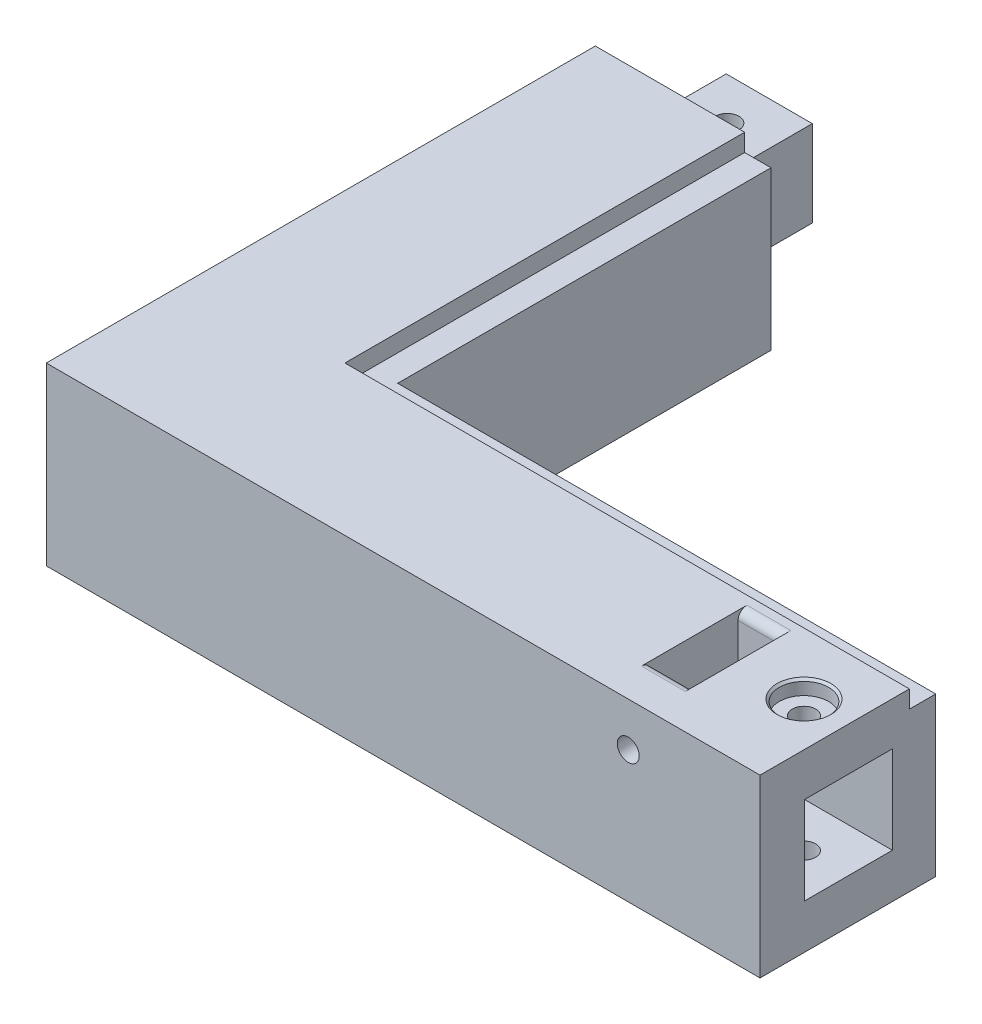
ISO-10303-21;
HEADER;
FILE_DESCRIPTION(('STEP AP214'),'2;1');
FILE_NAME('part.step','',(''),(''),'','','');
FILE_SCHEMA(('AUTOMOTIVE_DESIGN { 1 0 10303 214 1 1 1 1 }'));
ENDSEC;
DATA;
#1=APPLICATION_CONTEXT('core data for automotive mechanical design processes');
#2=APPLICATION_PROTOCOL_DEFINITION('international standard','automotive_design',2000,#1);
#3=PRODUCT_CONTEXT('',#1,'mechanical');
#4=PRODUCT('Part','Part','',(#3));
#5=PRODUCT_RELATED_PRODUCT_CATEGORY('part','',(#4));
#6=PRODUCT_DEFINITION_FORMATION('','',#4);
#7=PRODUCT_DEFINITION_CONTEXT('part definition',#1,'design');
#8=PRODUCT_DEFINITION('design','',#6,#7);
#9=PRODUCT_DEFINITION_SHAPE('','',#8);
#10=(LENGTH_UNIT() NAMED_UNIT(*) SI_UNIT(.MILLI.,.METRE.));
#11=(NAMED_UNIT(*) PLANE_ANGLE_UNIT() SI_UNIT($,.RADIAN.));
#12=(NAMED_UNIT(*) SI_UNIT($,.STERADIAN.) SOLID_ANGLE_UNIT());
#13=UNCERTAINTY_MEASURE_WITH_UNIT(LENGTH_MEASURE(1.E-05),#10,'distance_accuracy_value','');
#14=(GEOMETRIC_REPRESENTATION_CONTEXT(3) GLOBAL_UNCERTAINTY_ASSIGNED_CONTEXT((#13)) GLOBAL_UNIT_ASSIGNED_CONTEXT((#10,
#11,#12)) REPRESENTATION_CONTEXT('',''));
#15=CARTESIAN_POINT('',(0.,0.,0.));
#16=DIRECTION('',(0.,0.,1.));
#17=DIRECTION('',(1.,0.,0.));
#18=AXIS2_PLACEMENT_3D('',#15,#16,#17);
#19=CARTESIAN_POINT('',(-50.8,50.8,-107.95));
#20=DIRECTION('',(0.,0.,1.));
#21=DIRECTION('',(1.,0.,0.));
#22=AXIS2_PLACEMENT_3D('',#19,#20,#21);
#23=PLANE('',#22);
#24=DIRECTION('',(-1.,0.,0.));
#25=VECTOR('',#24,1.);
#26=CARTESIAN_POINT('',(-50.8,50.8,-107.95));
#27=LINE('',#26,#25);
#28=CARTESIAN_POINT('',(-7.61999999999999,50.8,-107.95));
#29=VERTEX_POINT('',#28);
#30=CARTESIAN_POINT('',(-50.8,50.8,-107.95));
#31=VERTEX_POINT('',#30);
#32=EDGE_CURVE('E224',#29,#31,#27,.T.);
#33=ORIENTED_EDGE('',*,*,#32,.F.);
#34=DIRECTION('',(0.,1.,0.));
#35=VECTOR('',#34,1.);
#36=CARTESIAN_POINT('',(-7.61999999999999,45.72,-107.95));
#37=LINE('',#36,#35);
#38=CARTESIAN_POINT('',(-7.61999999999999,45.72,-107.95));
#39=VERTEX_POINT('',#38);
#40=EDGE_CURVE('E62',#39,#29,#37,.T.);
#41=ORIENTED_EDGE('',*,*,#40,.F.);
#42=DIRECTION('',(-1.,0.,0.));
#43=VECTOR('',#42,1.);
#44=CARTESIAN_POINT('',(-7.61999999999999,45.72,-107.95));
#45=LINE('',#44,#43);
#46=CARTESIAN_POINT('',(0.,45.72,-107.95));
#47=VERTEX_POINT('',#46);
#48=EDGE_CURVE('E210',#47,#39,#45,.T.);
#49=ORIENTED_EDGE('',*,*,#48,.F.);
#50=DIRECTION('',(0.,-1.,0.));
#51=VECTOR('',#50,1.);
#52=CARTESIAN_POINT('',(0.,50.8,-107.95));
#53=LINE('',#52,#51);
#54=CARTESIAN_POINT('',(0.,0.,-107.95));
#55=VERTEX_POINT('',#54);
#56=EDGE_CURVE('E440',#47,#55,#53,.T.);
#57=ORIENTED_EDGE('',*,*,#56,.T.);
#58=DIRECTION('',(-1.,0.,0.));
#59=VECTOR('',#58,1.);
#60=CARTESIAN_POINT('',(-50.8,0.,-107.95));
#61=LINE('',#60,#59);
#62=CARTESIAN_POINT('',(-50.8,0.,-107.95));
#63=VERTEX_POINT('',#62);
#64=EDGE_CURVE('E407',#55,#63,#61,.T.);
#65=ORIENTED_EDGE('',*,*,#64,.T.);
#66=DIRECTION('',(0.,-1.,0.));
#67=VECTOR('',#66,1.);
#68=CARTESIAN_POINT('',(-50.8,50.8,-107.95));
#69=LINE('',#68,#67);
#70=EDGE_CURVE('E436',#31,#63,#69,.T.);
#71=ORIENTED_EDGE('',*,*,#70,.F.);
#72=EDGE_LOOP('',(#33,#41,#49,#57,#65,#71));
#73=FACE_BOUND('',#72,.T.);
#74=DIRECTION('',(0.,1.,0.));
#75=VECTOR('',#74,1.);
#76=CARTESIAN_POINT('',(-37.846,12.954,-107.95));
#77=LINE('',#76,#75);
#78=CARTESIAN_POINT('',(-37.846,12.954,-107.95));
#79=VERTEX_POINT('',#78);
#80=CARTESIAN_POINT('',(-37.846,37.846,-107.95));
#81=VERTEX_POINT('',#80);
#82=EDGE_CURVE('E290',#79,#81,#77,.T.);
#83=ORIENTED_EDGE('',*,*,#82,.F.);
#84=DIRECTION('',(-1.,0.,0.));
#85=VECTOR('',#84,1.);
#86=CARTESIAN_POINT('',(-12.954,12.954,-107.95));
#87=LINE('',#86,#85);
#88=CARTESIAN_POINT('',(-12.954,12.954,-107.95));
#89=VERTEX_POINT('',#88);
#90=EDGE_CURVE('E280',#89,#79,#87,.T.);
#91=ORIENTED_EDGE('',*,*,#90,.F.);
#92=DIRECTION('',(0.,-1.,0.));
#93=VECTOR('',#92,1.);
#94=CARTESIAN_POINT('',(-12.954,12.954,-107.95));
#95=LINE('',#94,#93);
#96=CARTESIAN_POINT('',(-12.954,37.846,-107.95));
#97=VERTEX_POINT('',#96);
#98=EDGE_CURVE('E298',#97,#89,#95,.T.);
#99=ORIENTED_EDGE('',*,*,#98,.F.);
#100=DIRECTION('',(1.,0.,0.));
#101=VECTOR('',#100,1.);
#102=CARTESIAN_POINT('',(-12.954,37.846,-107.95));
#103=LINE('',#102,#101);
#104=EDGE_CURVE('E294',#81,#97,#103,.T.);
#105=ORIENTED_EDGE('',*,*,#104,.F.);
#106=EDGE_LOOP('',(#83,#91,#99,#105));
#107=FACE_BOUND('',#106,.T.);
#108=ADVANCED_FACE('F45',(#73,#107),#23,.F.);
#109=CARTESIAN_POINT('',(0.,50.8,0.));
#110=DIRECTION('',(-1.,0.,0.));
#111=DIRECTION('',(0.,0.,1.));
#112=AXIS2_PLACEMENT_3D('',#109,#110,#111);
#113=PLANE('',#112);
#114=ORIENTED_EDGE('',*,*,#56,.F.);
#115=DIRECTION('',(0.,0.,-1.));
#116=VECTOR('',#115,1.);
#117=CARTESIAN_POINT('',(0.,45.72,-107.95));
#118=LINE('',#117,#116);
#119=CARTESIAN_POINT('',(0.,45.72,0.));
#120=VERTEX_POINT('',#119);
#121=EDGE_CURVE('E215',#120,#47,#118,.T.);
#122=ORIENTED_EDGE('',*,*,#121,.F.);
#123=DIRECTION('',(0.,-1.,0.));
#124=VECTOR('',#123,1.);
#125=CARTESIAN_POINT('',(0.,50.8,0.));
#126=LINE('',#125,#124);
#127=CARTESIAN_POINT('',(0.,0.,0.));
#128=VERTEX_POINT('',#127);
#129=EDGE_CURVE('E403',#120,#128,#126,.T.);
#130=ORIENTED_EDGE('',*,*,#129,.T.);
#131=DIRECTION('',(0.,0.,-1.));
#132=VECTOR('',#131,1.);
#133=CARTESIAN_POINT('',(0.,0.,0.));
#134=LINE('',#133,#132);
#135=EDGE_CURVE('E380',#128,#55,#134,.T.);
#136=ORIENTED_EDGE('',*,*,#135,.T.);
#137=EDGE_LOOP('',(#114,#122,#130,#136));
#138=FACE_BOUND('',#137,.T.);
#139=ADVANCED_FACE('F522',(#138),#113,.F.);
#140=CARTESIAN_POINT('',(-50.8,50.8,50.8));
#141=DIRECTION('',(1.,0.,0.));
#142=DIRECTION('',(0.,0.,-1.));
#143=AXIS2_PLACEMENT_3D('',#140,#141,#142);
#144=PLANE('',#143);
#145=DIRECTION('',(0.,0.,1.));
#146=VECTOR('',#145,1.);
#147=CARTESIAN_POINT('',(-50.8,0.,50.8));
#148=LINE('',#147,#146);
#149=CARTESIAN_POINT('',(-50.8,0.,50.8));
#150=VERTEX_POINT('',#149);
#151=EDGE_CURVE('E410',#63,#150,#148,.T.);
#152=ORIENTED_EDGE('',*,*,#151,.T.);
#153=DIRECTION('',(0.,-1.,0.));
#154=VECTOR('',#153,1.);
#155=CARTESIAN_POINT('',(-50.8,50.8,50.8));
#156=LINE('',#155,#154);
#157=CARTESIAN_POINT('',(-50.8,50.8,50.8));
#158=VERTEX_POINT('',#157);
#159=EDGE_CURVE('E432',#158,#150,#156,.T.);
#160=ORIENTED_EDGE('',*,*,#159,.F.);
#161=DIRECTION('',(0.,0.,1.));
#162=VECTOR('',#161,1.);
#163=CARTESIAN_POINT('',(-50.8,50.8,50.8));
#164=LINE('',#163,#162);
#165=EDGE_CURVE('E392',#31,#158,#164,.T.);
#166=ORIENTED_EDGE('',*,*,#165,.F.);
#167=ORIENTED_EDGE('',*,*,#70,.T.);
#168=EDGE_LOOP('',(#152,#160,#166,#167));
#169=FACE_BOUND('',#168,.T.);
#170=ADVANCED_FACE('F528',(#169),#144,.F.);
#171=CARTESIAN_POINT('',(-50.8,50.8,50.8));
#172=DIRECTION('',(0.,0.,-1.));
#173=DIRECTION('',(-1.,0.,0.));
#174=AXIS2_PLACEMENT_3D('',#171,#172,#173);
#175=PLANE('',#174);
#176=CARTESIAN_POINT('',(117.475,38.1,50.8));
#177=DIRECTION('',(0.,0.,1.));
#178=DIRECTION('',(1.,0.,0.));
#179=AXIS2_PLACEMENT_3D('',#176,#177,#178);
#180=CIRCLE('',#179,3.175);
#181=CARTESIAN_POINT('',(120.65,38.1,50.8));
#182=VERTEX_POINT('',#181);
#183=EDGE_CURVE('E498',#182,#182,#180,.T.);
#184=ORIENTED_EDGE('',*,*,#183,.F.);
#185=EDGE_LOOP('',(#184));
#186=FACE_BOUND('',#185,.T.);
#187=DIRECTION('',(1.,0.,0.));
#188=VECTOR('',#187,1.);
#189=CARTESIAN_POINT('',(-50.8,0.,50.8));
#190=LINE('',#189,#188);
#191=CARTESIAN_POINT('',(155.575,0.,50.8));
#192=VERTEX_POINT('',#191);
#193=EDGE_CURVE('E413',#150,#192,#190,.T.);
#194=ORIENTED_EDGE('',*,*,#193,.T.);
#195=DIRECTION('',(0.,-1.,0.));
#196=VECTOR('',#195,1.);
#197=CARTESIAN_POINT('',(155.575,50.8,50.8));
#198=LINE('',#197,#196);
#199=CARTESIAN_POINT('',(155.575,50.8,50.8));
#200=VERTEX_POINT('',#199);
#201=EDGE_CURVE('E428',#200,#192,#198,.T.);
#202=ORIENTED_EDGE('',*,*,#201,.F.);
#203=DIRECTION('',(1.,0.,0.));
#204=VECTOR('',#203,1.);
#205=CARTESIAN_POINT('',(-50.8,50.8,50.8));
#206=LINE('',#205,#204);
#207=EDGE_CURVE('E396',#158,#200,#206,.T.);
#208=ORIENTED_EDGE('',*,*,#207,.F.);
#209=ORIENTED_EDGE('',*,*,#159,.T.);
#210=EDGE_LOOP('',(#194,#202,#208,#209));
#211=FACE_BOUND('',#210,.T.);
#212=ADVANCED_FACE('F649',(#186,#211),#175,.F.);
#213=CARTESIAN_POINT('',(155.575,50.8,0.));
#214=DIRECTION('',(-1.,0.,0.));
#215=DIRECTION('',(0.,0.,1.));
#216=AXIS2_PLACEMENT_3D('',#213,#214,#215);
#217=PLANE('',#216);
#218=DIRECTION('',(0.,0.,1.));
#219=VECTOR('',#218,1.);
#220=CARTESIAN_POINT('',(155.575,38.26008800011,37.9399119998899));
#221=LINE('',#220,#219);
#222=CARTESIAN_POINT('',(155.575,38.26008800011,12.5399119998898));
#223=VERTEX_POINT('',#222);
#224=CARTESIAN_POINT('',(155.575,38.26008800011,37.9399119998899));
#225=VERTEX_POINT('',#224);
#226=EDGE_CURVE('E366',#223,#225,#221,.T.);
#227=ORIENTED_EDGE('',*,*,#226,.F.);
#228=DIRECTION('',(0.,1.,0.));
#229=VECTOR('',#228,1.);
#230=CARTESIAN_POINT('',(155.575,12.86008800011,12.5399119998899));
#231=LINE('',#230,#229);
#232=CARTESIAN_POINT('',(155.575,12.86008800011,12.5399119998899));
#233=VERTEX_POINT('',#232);
#234=EDGE_CURVE('E345',#233,#223,#231,.T.);
#235=ORIENTED_EDGE('',*,*,#234,.F.);
#236=DIRECTION('',(0.,0.,-1.));
#237=VECTOR('',#236,1.);
#238=CARTESIAN_POINT('',(155.575,12.86008800011,37.9399119998899));
#239=LINE('',#238,#237);
#240=CARTESIAN_POINT('',(155.575,12.86008800011,37.9399119998899));
#241=VERTEX_POINT('',#240);
#242=EDGE_CURVE('E351',#241,#233,#239,.T.);
#243=ORIENTED_EDGE('',*,*,#242,.F.);
#244=DIRECTION('',(0.,-1.,0.));
#245=VECTOR('',#244,1.);
#246=CARTESIAN_POINT('',(155.575,12.86008800011,37.9399119998899));
#247=LINE('',#246,#245);
#248=EDGE_CURVE('E370',#225,#241,#247,.T.);
#249=ORIENTED_EDGE('',*,*,#248,.F.);
#250=EDGE_LOOP('',(#227,#235,#243,#249));
#251=FACE_BOUND('',#250,.T.);
#252=DIRECTION('',(0.,0.,-1.));
#253=VECTOR('',#252,1.);
#254=CARTESIAN_POINT('',(155.575,45.72,0.));
#255=LINE('',#254,#253);
#256=CARTESIAN_POINT('',(155.575,45.72,7.62));
#257=VERTEX_POINT('',#256);
#258=CARTESIAN_POINT('',(155.575,45.72,0.));
#259=VERTEX_POINT('',#258);
#260=EDGE_CURVE('E486',#257,#259,#255,.T.);
#261=ORIENTED_EDGE('',*,*,#260,.F.);
#262=DIRECTION('',(0.,1.,0.));
#263=VECTOR('',#262,1.);
#264=CARTESIAN_POINT('',(155.575,45.72,7.62));
#265=LINE('',#264,#263);
#266=CARTESIAN_POINT('',(155.575,50.8,7.62));
#267=VERTEX_POINT('',#266);
#268=EDGE_CURVE('E229',#257,#267,#265,.T.);
#269=ORIENTED_EDGE('',*,*,#268,.T.);
#270=DIRECTION('',(0.,0.,-1.));
#271=VECTOR('',#270,1.);
#272=CARTESIAN_POINT('',(155.575,50.8,0.));
#273=LINE('',#272,#271);
#274=EDGE_CURVE('E399',#200,#267,#273,.T.);
#275=ORIENTED_EDGE('',*,*,#274,.F.);
#276=ORIENTED_EDGE('',*,*,#201,.T.);
#277=DIRECTION('',(0.,0.,-1.));
#278=VECTOR('',#277,1.);
#279=CARTESIAN_POINT('',(155.575,0.,0.));
#280=LINE('',#279,#278);
#281=CARTESIAN_POINT('',(155.575,0.,0.));
#282=VERTEX_POINT('',#281);
#283=EDGE_CURVE('E416',#192,#282,#280,.T.);
#284=ORIENTED_EDGE('',*,*,#283,.T.);
#285=DIRECTION('',(0.,-1.,0.));
#286=VECTOR('',#285,1.);
#287=CARTESIAN_POINT('',(155.575,50.8,0.));
#288=LINE('',#287,#286);
#289=EDGE_CURVE('E425',#259,#282,#288,.T.);
#290=ORIENTED_EDGE('',*,*,#289,.F.);
#291=EDGE_LOOP('',(#261,#269,#275,#276,#284,#290));
#292=FACE_BOUND('',#291,.T.);
#293=ADVANCED_FACE('F646',(#251,#292),#217,.F.);
#294=CARTESIAN_POINT('',(0.,50.8,0.));
#295=DIRECTION('',(0.,0.,1.));
#296=DIRECTION('',(1.,0.,0.));
#297=AXIS2_PLACEMENT_3D('',#294,#295,#296);
#298=PLANE('',#297);
#299=CARTESIAN_POINT('',(117.475,38.1,0.));
#300=DIRECTION('',(0.,0.,1.));
#301=DIRECTION('',(1.,0.,0.));
#302=AXIS2_PLACEMENT_3D('',#299,#300,#301);
#303=CIRCLE('',#302,3.175);
#304=CARTESIAN_POINT('',(120.65,38.1,0.));
#305=VERTEX_POINT('',#304);
#306=EDGE_CURVE('E482',#305,#305,#303,.T.);
#307=ORIENTED_EDGE('',*,*,#306,.T.);
#308=EDGE_LOOP('',(#307));
#309=FACE_BOUND('',#308,.T.);
#310=ORIENTED_EDGE('',*,*,#129,.F.);
#311=DIRECTION('',(-1.,0.,0.));
#312=VECTOR('',#311,1.);
#313=CARTESIAN_POINT('',(0.,45.72,0.));
#314=LINE('',#313,#312);
#315=EDGE_CURVE('E231',#259,#120,#314,.T.);
#316=ORIENTED_EDGE('',*,*,#315,.F.);
#317=ORIENTED_EDGE('',*,*,#289,.T.);
#318=DIRECTION('',(-1.,0.,0.));
#319=VECTOR('',#318,1.);
#320=CARTESIAN_POINT('',(0.,0.,0.));
#321=LINE('',#320,#319);
#322=EDGE_CURVE('E393',#282,#128,#321,.T.);
#323=ORIENTED_EDGE('',*,*,#322,.T.);
#324=EDGE_LOOP('',(#310,#316,#317,#323));
#325=FACE_BOUND('',#324,.T.);
#326=ADVANCED_FACE('F641',(#309,#325),#298,.F.);
#327=CARTESIAN_POINT('',(0.,50.8,0.));
#328=DIRECTION('',(0.,-1.,0.));
#329=DIRECTION('',(0.,0.,-1.));
#330=AXIS2_PLACEMENT_3D('',#327,#328,#329);
#331=PLANE('',#330);
#332=DIRECTION('',(0.,0.,1.));
#333=VECTOR('',#332,1.);
#334=CARTESIAN_POINT('',(123.825,50.8,12.7));
#335=LINE('',#334,#333);
#336=CARTESIAN_POINT('',(123.825,50.8,10.16));
#337=VERTEX_POINT('',#336);
#338=CARTESIAN_POINT('',(123.825,50.8,40.64));
#339=VERTEX_POINT('',#338);
#340=EDGE_CURVE('E240',#337,#339,#335,.T.);
#341=ORIENTED_EDGE('',*,*,#340,.T.);
#342=DIRECTION('',(1.,0.,0.));
#343=VECTOR('',#342,1.);
#344=CARTESIAN_POINT('',(0.,50.8,40.64));
#345=LINE('',#344,#343);
#346=CARTESIAN_POINT('',(111.125,50.8,40.64));
#347=VERTEX_POINT('',#346);
#348=EDGE_CURVE('E457',#339,#347,#345,.F.);
#349=ORIENTED_EDGE('',*,*,#348,.T.);
#350=DIRECTION('',(0.,0.,1.));
#351=VECTOR('',#350,1.);
#352=CARTESIAN_POINT('',(111.125,50.8,12.7));
#353=LINE('',#352,#351);
#354=CARTESIAN_POINT('',(111.125,50.8,10.16));
#355=VERTEX_POINT('',#354);
#356=EDGE_CURVE('E251',#355,#347,#353,.T.);
#357=ORIENTED_EDGE('',*,*,#356,.F.);
#358=DIRECTION('',(1.,0.,0.));
#359=VECTOR('',#358,1.);
#360=CARTESIAN_POINT('',(123.825,50.8,10.16));
#361=LINE('',#360,#359);
#362=EDGE_CURVE('E453',#355,#337,#361,.T.);
#363=ORIENTED_EDGE('',*,*,#362,.T.);
#364=EDGE_LOOP('',(#341,#349,#357,#363));
#365=FACE_BOUND('',#364,.T.);
#366=CARTESIAN_POINT('',(142.875,50.8,25.4));
#367=DIRECTION('',(0.,1.,0.));
#368=DIRECTION('',(0.,0.,1.));
#369=AXIS2_PLACEMENT_3D('',#366,#367,#368);
#370=CIRCLE('',#369,7.77875);
#371=CARTESIAN_POINT('',(142.875,50.8,33.17875));
#372=VERTEX_POINT('',#371);
#373=EDGE_CURVE('E320',#372,#372,#370,.T.);
#374=ORIENTED_EDGE('',*,*,#373,.F.);
#375=EDGE_LOOP('',(#374));
#376=FACE_BOUND('',#375,.T.);
#377=ORIENTED_EDGE('',*,*,#274,.T.);
#378=DIRECTION('',(1.,0.,0.));
#379=VECTOR('',#378,1.);
#380=CARTESIAN_POINT('',(155.575,50.8,7.62));
#381=LINE('',#380,#379);
#382=CARTESIAN_POINT('',(-7.61999999999999,50.8,7.62000000000002));
#383=VERTEX_POINT('',#382);
#384=EDGE_CURVE('E219',#383,#267,#381,.T.);
#385=ORIENTED_EDGE('',*,*,#384,.F.);
#386=DIRECTION('',(0.,0.,1.));
#387=VECTOR('',#386,1.);
#388=CARTESIAN_POINT('',(-7.61999999999999,50.8,7.62000000000002));
#389=LINE('',#388,#387);
#390=EDGE_CURVE('E480',#29,#383,#389,.T.);
#391=ORIENTED_EDGE('',*,*,#390,.F.);
#392=ORIENTED_EDGE('',*,*,#32,.T.);
#393=ORIENTED_EDGE('',*,*,#165,.T.);
#394=ORIENTED_EDGE('',*,*,#207,.T.);
#395=EDGE_LOOP('',(#377,#385,#391,#392,#393,#394));
#396=FACE_BOUND('',#395,.T.);
#397=ADVANCED_FACE('F560',(#365,#376,#396),#331,.F.);
#398=CARTESIAN_POINT('',(0.,0.,0.));
#399=DIRECTION('',(0.,-1.,0.));
#400=DIRECTION('',(0.,0.,-1.));
#401=AXIS2_PLACEMENT_3D('',#398,#399,#400);
#402=PLANE('',#401);
#403=CARTESIAN_POINT('',(142.875,0.,25.4));
#404=DIRECTION('',(0.,1.,0.));
#405=DIRECTION('',(0.,0.,1.));
#406=AXIS2_PLACEMENT_3D('',#403,#404,#405);
#407=CIRCLE('',#406,3.3782);
#408=CARTESIAN_POINT('',(142.875,0.,28.7782));
#409=VERTEX_POINT('',#408);
#410=EDGE_CURVE('E336',#409,#409,#407,.T.);
#411=ORIENTED_EDGE('',*,*,#410,.T.);
#412=EDGE_LOOP('',(#411));
#413=FACE_BOUND('',#412,.T.);
#414=ORIENTED_EDGE('',*,*,#135,.F.);
#415=ORIENTED_EDGE('',*,*,#322,.F.);
#416=ORIENTED_EDGE('',*,*,#283,.F.);
#417=ORIENTED_EDGE('',*,*,#193,.F.);
#418=ORIENTED_EDGE('',*,*,#151,.F.);
#419=ORIENTED_EDGE('',*,*,#64,.F.);
#420=EDGE_LOOP('',(#414,#415,#416,#417,#418,#419));
#421=FACE_BOUND('',#420,.T.);
#422=ADVANCED_FACE('F637',(#413,#421),#402,.T.);
#423=CARTESIAN_POINT('',(130.175,12.86008800011,12.5399119998898));
#424=DIRECTION('',(0.,0.,-1.));
#425=DIRECTION('',(-1.,0.,0.));
#426=AXIS2_PLACEMENT_3D('',#423,#424,#425);
#427=PLANE('',#426);
#428=ORIENTED_EDGE('',*,*,#234,.T.);
#429=DIRECTION('',(1.,0.,0.));
#430=VECTOR('',#429,1.);
#431=CARTESIAN_POINT('',(130.175,38.26008800011,12.5399119998898));
#432=LINE('',#431,#430);
#433=CARTESIAN_POINT('',(130.175,38.26008800011,12.5399119998898));
#434=VERTEX_POINT('',#433);
#435=EDGE_CURVE('E363',#434,#223,#432,.T.);
#436=ORIENTED_EDGE('',*,*,#435,.F.);
#437=DIRECTION('',(0.,1.,0.));
#438=VECTOR('',#437,1.);
#439=CARTESIAN_POINT('',(130.175,12.86008800011,12.5399119998898));
#440=LINE('',#439,#438);
#441=CARTESIAN_POINT('',(130.175,12.86008800011,12.5399119998898));
#442=VERTEX_POINT('',#441);
#443=EDGE_CURVE('E346',#442,#434,#440,.T.);
#444=ORIENTED_EDGE('',*,*,#443,.F.);
#445=DIRECTION('',(1.,0.,0.));
#446=VECTOR('',#445,1.);
#447=CARTESIAN_POINT('',(130.175,12.86008800011,12.5399119998898));
#448=LINE('',#447,#446);
#449=EDGE_CURVE('E377',#442,#233,#448,.T.);
#450=ORIENTED_EDGE('',*,*,#449,.T.);
#451=EDGE_LOOP('',(#428,#436,#444,#450));
#452=FACE_BOUND('',#451,.T.);
#453=ADVANCED_FACE('F627',(#452),#427,.F.);
#454=CARTESIAN_POINT('',(130.175,12.86008800011,37.9399119998898));
#455=DIRECTION('',(0.,-1.,0.));
#456=DIRECTION('',(0.,0.,-1.));
#457=AXIS2_PLACEMENT_3D('',#454,#455,#456);
#458=PLANE('',#457);
#459=CARTESIAN_POINT('',(142.875,12.86008800011,25.4));
#460=DIRECTION('',(0.,-1.,0.));
#461=DIRECTION('',(0.,0.,-1.));
#462=AXIS2_PLACEMENT_3D('',#459,#460,#461);
#463=CIRCLE('',#462,3.3782);
#464=CARTESIAN_POINT('',(142.875,12.86008800011,22.0218));
#465=VERTEX_POINT('',#464);
#466=EDGE_CURVE('E341',#465,#465,#463,.T.);
#467=ORIENTED_EDGE('',*,*,#466,.T.);
#468=EDGE_LOOP('',(#467));
#469=FACE_BOUND('',#468,.T.);
#470=ORIENTED_EDGE('',*,*,#242,.T.);
#471=ORIENTED_EDGE('',*,*,#449,.F.);
#472=DIRECTION('',(0.,0.,-1.));
#473=VECTOR('',#472,1.);
#474=CARTESIAN_POINT('',(130.175,12.86008800011,37.9399119998898));
#475=LINE('',#474,#473);
#476=CARTESIAN_POINT('',(130.175,12.86008800011,37.9399119998898));
#477=VERTEX_POINT('',#476);
#478=EDGE_CURVE('E359',#477,#442,#475,.T.);
#479=ORIENTED_EDGE('',*,*,#478,.F.);
#480=DIRECTION('',(1.,0.,0.));
#481=VECTOR('',#480,1.);
#482=CARTESIAN_POINT('',(130.175,12.86008800011,37.9399119998898));
#483=LINE('',#482,#481);
#484=EDGE_CURVE('E381',#477,#241,#483,.T.);
#485=ORIENTED_EDGE('',*,*,#484,.T.);
#486=EDGE_LOOP('',(#470,#471,#479,#485));
#487=FACE_BOUND('',#486,.T.);
#488=ADVANCED_FACE('F623',(#469,#487),#458,.F.);
#489=CARTESIAN_POINT('',(130.175,12.86008800011,37.9399119998898));
#490=DIRECTION('',(0.,0.,1.));
#491=DIRECTION('',(1.,0.,0.));
#492=AXIS2_PLACEMENT_3D('',#489,#490,#491);
#493=PLANE('',#492);
#494=ORIENTED_EDGE('',*,*,#248,.T.);
#495=ORIENTED_EDGE('',*,*,#484,.F.);
#496=DIRECTION('',(0.,-1.,0.));
#497=VECTOR('',#496,1.);
#498=CARTESIAN_POINT('',(130.175,12.86008800011,37.9399119998898));
#499=LINE('',#498,#497);
#500=CARTESIAN_POINT('',(130.175,38.26008800011,37.9399119998898));
#501=VERTEX_POINT('',#500);
#502=EDGE_CURVE('E355',#501,#477,#499,.T.);
#503=ORIENTED_EDGE('',*,*,#502,.F.);
#504=DIRECTION('',(1.,0.,0.));
#505=VECTOR('',#504,1.);
#506=CARTESIAN_POINT('',(130.175,38.26008800011,37.9399119998898));
#507=LINE('',#506,#505);
#508=EDGE_CURVE('E384',#501,#225,#507,.T.);
#509=ORIENTED_EDGE('',*,*,#508,.T.);
#510=EDGE_LOOP('',(#494,#495,#503,#509));
#511=FACE_BOUND('',#510,.T.);
#512=ADVANCED_FACE('F626',(#511),#493,.F.);
#513=CARTESIAN_POINT('',(130.175,38.26008800011,37.9399119998898));
#514=DIRECTION('',(0.,1.,0.));
#515=DIRECTION('',(0.,0.,1.));
#516=AXIS2_PLACEMENT_3D('',#513,#514,#515);
#517=PLANE('',#516);
#518=CARTESIAN_POINT('',(142.875,38.26008800011,25.4));
#519=DIRECTION('',(0.,1.,0.));
#520=DIRECTION('',(0.,0.,1.));
#521=AXIS2_PLACEMENT_3D('',#518,#519,#520);
#522=CIRCLE('',#521,3.3782);
#523=CARTESIAN_POINT('',(142.875,38.26008800011,28.7782));
#524=VERTEX_POINT('',#523);
#525=EDGE_CURVE('E340',#524,#524,#522,.T.);
#526=ORIENTED_EDGE('',*,*,#525,.T.);
#527=EDGE_LOOP('',(#526));
#528=FACE_BOUND('',#527,.T.);
#529=ORIENTED_EDGE('',*,*,#226,.T.);
#530=ORIENTED_EDGE('',*,*,#508,.F.);
#531=DIRECTION('',(0.,0.,1.));
#532=VECTOR('',#531,1.);
#533=CARTESIAN_POINT('',(130.175,38.26008800011,37.9399119998898));
#534=LINE('',#533,#532);
#535=EDGE_CURVE('E350',#434,#501,#534,.T.);
#536=ORIENTED_EDGE('',*,*,#535,.F.);
#537=ORIENTED_EDGE('',*,*,#435,.T.);
#538=EDGE_LOOP('',(#529,#530,#536,#537));
#539=FACE_BOUND('',#538,.T.);
#540=ADVANCED_FACE('F621',(#528,#539),#517,.F.);
#541=CARTESIAN_POINT('',(130.175,0.,1.42247325030098E-13));
#542=DIRECTION('',(-1.,0.,0.));
#543=DIRECTION('',(0.,0.,1.));
#544=AXIS2_PLACEMENT_3D('',#541,#542,#543);
#545=PLANE('',#544);
#546=ORIENTED_EDGE('',*,*,#443,.T.);
#547=ORIENTED_EDGE('',*,*,#535,.T.);
#548=ORIENTED_EDGE('',*,*,#502,.T.);
#549=ORIENTED_EDGE('',*,*,#478,.T.);
#550=EDGE_LOOP('',(#546,#547,#548,#549));
#551=FACE_BOUND('',#550,.T.);
#552=ADVANCED_FACE('F606',(#551),#545,.F.);
#553=CARTESIAN_POINT('',(142.875,50.8,25.4));
#554=DIRECTION('',(0.,1.,0.));
#555=DIRECTION('',(0.,0.,1.));
#556=AXIS2_PLACEMENT_3D('',#553,#554,#555);
#557=CONICAL_SURFACE('',#556,7.77875,0.785398163397443);
#558=CARTESIAN_POINT('',(142.875,50.165,25.4));
#559=DIRECTION('',(0.,1.,0.));
#560=DIRECTION('',(0.,0.,1.));
#561=AXIS2_PLACEMENT_3D('',#558,#559,#560);
#562=CIRCLE('',#561,7.14375);
#563=CARTESIAN_POINT('',(142.875,50.165,32.54375));
#564=VERTEX_POINT('',#563);
#565=EDGE_CURVE('E324',#564,#564,#562,.T.);
#566=ORIENTED_EDGE('',*,*,#565,.F.);
#567=EDGE_LOOP('',(#566));
#568=FACE_BOUND('',#567,.T.);
#569=ORIENTED_EDGE('',*,*,#373,.T.);
#570=EDGE_LOOP('',(#569));
#571=FACE_BOUND('',#570,.T.);
#572=ADVANCED_FACE('F602',(#568,#571),#557,.F.);
#573=CARTESIAN_POINT('',(142.875,50.8,25.4));
#574=DIRECTION('',(0.,1.,0.));
#575=DIRECTION('',(0.,0.,1.));
#576=AXIS2_PLACEMENT_3D('',#573,#574,#575);
#577=CYLINDRICAL_SURFACE('',#576,7.14375);
#578=CARTESIAN_POINT('',(142.875,46.609,25.4));
#579=DIRECTION('',(0.,1.,0.));
#580=DIRECTION('',(0.,0.,1.));
#581=AXIS2_PLACEMENT_3D('',#578,#579,#580);
#582=CIRCLE('',#581,7.14375);
#583=CARTESIAN_POINT('',(142.875,46.609,32.54375));
#584=VERTEX_POINT('',#583);
#585=EDGE_CURVE('E328',#584,#584,#582,.T.);
#586=ORIENTED_EDGE('',*,*,#585,.F.);
#587=EDGE_LOOP('',(#586));
#588=FACE_BOUND('',#587,.T.);
#589=ORIENTED_EDGE('',*,*,#565,.T.);
#590=EDGE_LOOP('',(#589));
#591=FACE_BOUND('',#590,.T.);
#592=ADVANCED_FACE('F605',(#588,#591),#577,.F.);
#593=CARTESIAN_POINT('',(150.01875,46.609,25.4));
#594=DIRECTION('',(0.,-1.,0.));
#595=DIRECTION('',(0.,0.,-1.));
#596=AXIS2_PLACEMENT_3D('',#593,#594,#595);
#597=PLANE('',#596);
#598=CARTESIAN_POINT('',(142.875,46.609,25.4));
#599=DIRECTION('',(0.,1.,0.));
#600=DIRECTION('',(0.,0.,1.));
#601=AXIS2_PLACEMENT_3D('',#598,#599,#600);
#602=CIRCLE('',#601,3.3782);
#603=CARTESIAN_POINT('',(142.875,46.609,28.7782));
#604=VERTEX_POINT('',#603);
#605=EDGE_CURVE('E332',#604,#604,#602,.T.);
#606=ORIENTED_EDGE('',*,*,#605,.F.);
#607=EDGE_LOOP('',(#606));
#608=FACE_BOUND('',#607,.T.);
#609=ORIENTED_EDGE('',*,*,#585,.T.);
#610=EDGE_LOOP('',(#609));
#611=FACE_BOUND('',#610,.T.);
#612=ADVANCED_FACE('F610',(#608,#611),#597,.F.);
#613=CARTESIAN_POINT('',(142.875,50.8,25.4));
#614=DIRECTION('',(0.,1.,0.));
#615=DIRECTION('',(0.,0.,1.));
#616=AXIS2_PLACEMENT_3D('',#613,#614,#615);
#617=CYLINDRICAL_SURFACE('',#616,3.3782);
#618=ORIENTED_EDGE('',*,*,#605,.T.);
#619=EDGE_LOOP('',(#618));
#620=FACE_BOUND('',#619,.T.);
#621=ORIENTED_EDGE('',*,*,#525,.F.);
#622=EDGE_LOOP('',(#621));
#623=FACE_BOUND('',#622,.T.);
#624=ADVANCED_FACE('F614',(#620,#623),#617,.F.);
#625=ORIENTED_EDGE('',*,*,#410,.F.);
#626=EDGE_LOOP('',(#625));
#627=FACE_BOUND('',#626,.T.);
#628=ORIENTED_EDGE('',*,*,#466,.F.);
#629=EDGE_LOOP('',(#628));
#630=FACE_BOUND('',#629,.T.);
#631=ADVANCED_FACE('F600',(#627,#630),#617,.F.);
#632=CARTESIAN_POINT('',(-37.846,12.954,-132.842));
#633=DIRECTION('',(1.,0.,0.));
#634=DIRECTION('',(0.,0.,-1.));
#635=AXIS2_PLACEMENT_3D('',#632,#633,#634);
#636=PLANE('',#635);
#637=ORIENTED_EDGE('',*,*,#82,.T.);
#638=DIRECTION('',(0.,0.,1.));
#639=VECTOR('',#638,1.);
#640=CARTESIAN_POINT('',(-37.846,37.846,-132.842));
#641=LINE('',#640,#639);
#642=CARTESIAN_POINT('',(-37.846,37.846,-132.842));
#643=VERTEX_POINT('',#642);
#644=EDGE_CURVE('E316',#643,#81,#641,.T.);
#645=ORIENTED_EDGE('',*,*,#644,.F.);
#646=DIRECTION('',(0.,1.,0.));
#647=VECTOR('',#646,1.);
#648=CARTESIAN_POINT('',(-37.846,12.954,-132.842));
#649=LINE('',#648,#647);
#650=CARTESIAN_POINT('',(-37.846,12.954,-132.842));
#651=VERTEX_POINT('',#650);
#652=EDGE_CURVE('E275',#651,#643,#649,.T.);
#653=ORIENTED_EDGE('',*,*,#652,.F.);
#654=DIRECTION('',(0.,0.,1.));
#655=VECTOR('',#654,1.);
#656=CARTESIAN_POINT('',(-37.846,12.954,-132.842));
#657=LINE('',#656,#655);
#658=EDGE_CURVE('E289',#651,#79,#657,.T.);
#659=ORIENTED_EDGE('',*,*,#658,.T.);
#660=EDGE_LOOP('',(#637,#645,#653,#659));
#661=FACE_BOUND('',#660,.T.);
#662=ADVANCED_FACE('F596',(#661),#636,.F.);
#663=CARTESIAN_POINT('',(-12.954,37.846,-132.842));
#664=DIRECTION('',(0.,-1.,0.));
#665=DIRECTION('',(0.,0.,-1.));
#666=AXIS2_PLACEMENT_3D('',#663,#664,#665);
#667=PLANE('',#666);
#668=CARTESIAN_POINT('',(-25.4,37.846,-120.65));
#669=DIRECTION('',(0.,1.,0.));
#670=DIRECTION('',(0.,0.,1.));
#671=AXIS2_PLACEMENT_3D('',#668,#669,#670);
#672=CIRCLE('',#671,3.429);
#673=CARTESIAN_POINT('',(-25.4,37.846,-117.221));
#674=VERTEX_POINT('',#673);
#675=EDGE_CURVE('E260',#674,#674,#672,.T.);
#676=ORIENTED_EDGE('',*,*,#675,.F.);
#677=EDGE_LOOP('',(#676));
#678=FACE_BOUND('',#677,.T.);
#679=ORIENTED_EDGE('',*,*,#104,.T.);
#680=DIRECTION('',(0.,0.,1.));
#681=VECTOR('',#680,1.);
#682=CARTESIAN_POINT('',(-12.954,37.846,-132.842));
#683=LINE('',#682,#681);
#684=CARTESIAN_POINT('',(-12.954,37.846,-132.842));
#685=VERTEX_POINT('',#684);
#686=EDGE_CURVE('E312',#685,#97,#683,.T.);
#687=ORIENTED_EDGE('',*,*,#686,.F.);
#688=DIRECTION('',(1.,0.,0.));
#689=VECTOR('',#688,1.);
#690=CARTESIAN_POINT('',(-12.954,37.846,-132.842));
#691=LINE('',#690,#689);
#692=EDGE_CURVE('E279',#643,#685,#691,.T.);
#693=ORIENTED_EDGE('',*,*,#692,.F.);
#694=ORIENTED_EDGE('',*,*,#644,.T.);
#695=EDGE_LOOP('',(#679,#687,#693,#694));
#696=FACE_BOUND('',#695,.T.);
#697=ADVANCED_FACE('F592',(#678,#696),#667,.F.);
#698=CARTESIAN_POINT('',(-12.954,12.954,-132.842));
#699=DIRECTION('',(-1.,0.,0.));
#700=DIRECTION('',(0.,0.,1.));
#701=AXIS2_PLACEMENT_3D('',#698,#699,#700);
#702=PLANE('',#701);
#703=ORIENTED_EDGE('',*,*,#98,.T.);
#704=DIRECTION('',(0.,0.,1.));
#705=VECTOR('',#704,1.);
#706=CARTESIAN_POINT('',(-12.954,12.954,-132.842));
#707=LINE('',#706,#705);
#708=CARTESIAN_POINT('',(-12.954,12.954,-132.842));
#709=VERTEX_POINT('',#708);
#710=EDGE_CURVE('E308',#709,#89,#707,.T.);
#711=ORIENTED_EDGE('',*,*,#710,.F.);
#712=DIRECTION('',(0.,-1.,0.));
#713=VECTOR('',#712,1.);
#714=CARTESIAN_POINT('',(-12.954,12.954,-132.842));
#715=LINE('',#714,#713);
#716=EDGE_CURVE('E283',#685,#709,#715,.T.);
#717=ORIENTED_EDGE('',*,*,#716,.F.);
#718=ORIENTED_EDGE('',*,*,#686,.T.);
#719=EDGE_LOOP('',(#703,#711,#717,#718));
#720=FACE_BOUND('',#719,.T.);
#721=ADVANCED_FACE('F588',(#720),#702,.F.);
#722=CARTESIAN_POINT('',(-12.954,12.954,-132.842));
#723=DIRECTION('',(0.,1.,0.));
#724=DIRECTION('',(0.,0.,1.));
#725=AXIS2_PLACEMENT_3D('',#722,#723,#724);
#726=PLANE('',#725);
#727=CARTESIAN_POINT('',(-25.4,12.954,-120.65));
#728=DIRECTION('',(0.,1.,0.));
#729=DIRECTION('',(0.,0.,1.));
#730=AXIS2_PLACEMENT_3D('',#727,#728,#729);
#731=CIRCLE('',#730,3.429);
#732=CARTESIAN_POINT('',(-25.4,12.954,-117.221));
#733=VERTEX_POINT('',#732);
#734=EDGE_CURVE('E274',#733,#733,#731,.T.);
#735=ORIENTED_EDGE('',*,*,#734,.T.);
#736=EDGE_LOOP('',(#735));
#737=FACE_BOUND('',#736,.T.);
#738=ORIENTED_EDGE('',*,*,#90,.T.);
#739=ORIENTED_EDGE('',*,*,#658,.F.);
#740=DIRECTION('',(-1.,0.,0.));
#741=VECTOR('',#740,1.);
#742=CARTESIAN_POINT('',(-12.954,12.954,-132.842));
#743=LINE('',#742,#741);
#744=EDGE_CURVE('E286',#709,#651,#743,.T.);
#745=ORIENTED_EDGE('',*,*,#744,.F.);
#746=ORIENTED_EDGE('',*,*,#710,.T.);
#747=EDGE_LOOP('',(#738,#739,#745,#746));
#748=FACE_BOUND('',#747,.T.);
#749=ADVANCED_FACE('F584',(#737,#748),#726,.F.);
#750=CARTESIAN_POINT('',(-1.47569031824156E-13,0.,-132.842));
#751=DIRECTION('',(0.,0.,1.));
#752=DIRECTION('',(1.,0.,0.));
#753=AXIS2_PLACEMENT_3D('',#750,#751,#752);
#754=PLANE('',#753);
#755=ORIENTED_EDGE('',*,*,#652,.T.);
#756=ORIENTED_EDGE('',*,*,#692,.T.);
#757=ORIENTED_EDGE('',*,*,#716,.T.);
#758=ORIENTED_EDGE('',*,*,#744,.T.);
#759=EDGE_LOOP('',(#755,#756,#757,#758));
#760=FACE_BOUND('',#759,.T.);
#761=ADVANCED_FACE('F580',(#760),#754,.F.);
#762=CARTESIAN_POINT('',(-25.4,12.446,-120.65));
#763=DIRECTION('',(0.,1.,0.));
#764=DIRECTION('',(0.,0.,1.));
#765=AXIS2_PLACEMENT_3D('',#762,#763,#764);
#766=CYLINDRICAL_SURFACE('',#765,3.429);
#767=ORIENTED_EDGE('',*,*,#675,.T.);
#768=EDGE_LOOP('',(#767));
#769=FACE_BOUND('',#768,.T.);
#770=ORIENTED_EDGE('',*,*,#734,.F.);
#771=EDGE_LOOP('',(#770));
#772=FACE_BOUND('',#771,.T.);
#773=ADVANCED_FACE('F572',(#769,#772),#766,.F.);
#774=CARTESIAN_POINT('',(111.125,24.892,12.7));
#775=DIRECTION('',(-1.,0.,0.));
#776=DIRECTION('',(0.,0.,1.));
#777=AXIS2_PLACEMENT_3D('',#774,#775,#776);
#778=PLANE('',#777);
#779=ORIENTED_EDGE('',*,*,#356,.T.);
#780=CARTESIAN_POINT('',(111.125,48.26,40.64));
#781=DIRECTION('',(-1.,0.,0.));
#782=DIRECTION('',(0.,0.,1.));
#783=AXIS2_PLACEMENT_3D('',#780,#781,#782);
#784=CIRCLE('',#783,2.54);
#785=CARTESIAN_POINT('',(111.125,48.26,38.1));
#786=VERTEX_POINT('',#785);
#787=EDGE_CURVE('E468',#347,#786,#784,.T.);
#788=ORIENTED_EDGE('',*,*,#787,.T.);
#789=DIRECTION('',(0.,1.,0.));
#790=VECTOR('',#789,1.);
#791=CARTESIAN_POINT('',(111.125,24.892,38.1));
#792=LINE('',#791,#790);
#793=CARTESIAN_POINT('',(111.125,24.892,38.1));
#794=VERTEX_POINT('',#793);
#795=EDGE_CURVE('E250',#794,#786,#792,.T.);
#796=ORIENTED_EDGE('',*,*,#795,.F.);
#797=DIRECTION('',(0.,0.,1.));
#798=VECTOR('',#797,1.);
#799=CARTESIAN_POINT('',(111.125,24.892,12.7));
#800=LINE('',#799,#798);
#801=CARTESIAN_POINT('',(111.125,24.892,12.7));
#802=VERTEX_POINT('',#801);
#803=EDGE_CURVE('E235',#802,#794,#800,.T.);
#804=ORIENTED_EDGE('',*,*,#803,.F.);
#805=DIRECTION('',(0.,1.,0.));
#806=VECTOR('',#805,1.);
#807=CARTESIAN_POINT('',(111.125,24.892,12.7));
#808=LINE('',#807,#806);
#809=CARTESIAN_POINT('',(111.125,48.26,12.7));
#810=VERTEX_POINT('',#809);
#811=EDGE_CURVE('E256',#802,#810,#808,.T.);
#812=ORIENTED_EDGE('',*,*,#811,.T.);
#813=CARTESIAN_POINT('',(111.125,48.26,10.16));
#814=DIRECTION('',(-1.,0.,0.));
#815=DIRECTION('',(0.,0.,1.));
#816=AXIS2_PLACEMENT_3D('',#813,#814,#815);
#817=CIRCLE('',#816,2.54);
#818=EDGE_CURVE('E11',#810,#355,#817,.T.);
#819=ORIENTED_EDGE('',*,*,#818,.T.);
#820=EDGE_LOOP('',(#779,#788,#796,#804,#812,#819));
#821=FACE_BOUND('',#820,.T.);
#822=ADVANCED_FACE('F549',(#821),#778,.F.);
#823=CARTESIAN_POINT('',(111.125,24.892,12.7));
#824=DIRECTION('',(0.,0.,1.));
#825=DIRECTION('',(1.,0.,0.));
#826=AXIS2_PLACEMENT_3D('',#823,#824,#825);
#827=PLANE('',#826);
#828=CARTESIAN_POINT('',(117.475,38.1,12.7));
#829=DIRECTION('',(0.,0.,1.));
#830=DIRECTION('',(1.,0.,0.));
#831=AXIS2_PLACEMENT_3D('',#828,#829,#830);
#832=CIRCLE('',#831,3.175);
#833=CARTESIAN_POINT('',(120.65,38.1,12.7));
#834=VERTEX_POINT('',#833);
#835=EDGE_CURVE('E494',#834,#834,#832,.T.);
#836=ORIENTED_EDGE('',*,*,#835,.F.);
#837=EDGE_LOOP('',(#836));
#838=FACE_BOUND('',#837,.T.);
#839=DIRECTION('',(0.,1.,0.));
#840=VECTOR('',#839,1.);
#841=CARTESIAN_POINT('',(123.825,24.892,12.7));
#842=LINE('',#841,#840);
#843=CARTESIAN_POINT('',(123.825,24.892,12.7));
#844=VERTEX_POINT('',#843);
#845=CARTESIAN_POINT('',(123.825,48.26,12.7));
#846=VERTEX_POINT('',#845);
#847=EDGE_CURVE('E261',#844,#846,#842,.T.);
#848=ORIENTED_EDGE('',*,*,#847,.T.);
#849=DIRECTION('',(1.,0.,0.));
#850=VECTOR('',#849,1.);
#851=CARTESIAN_POINT('',(111.125,48.26,12.7));
#852=LINE('',#851,#850);
#853=EDGE_CURVE('E461',#846,#810,#852,.F.);
#854=ORIENTED_EDGE('',*,*,#853,.T.);
#855=ORIENTED_EDGE('',*,*,#811,.F.);
#856=DIRECTION('',(1.,0.,0.));
#857=VECTOR('',#856,1.);
#858=CARTESIAN_POINT('',(111.125,24.892,12.7));
#859=LINE('',#858,#857);
#860=EDGE_CURVE('E247',#802,#844,#859,.T.);
#861=ORIENTED_EDGE('',*,*,#860,.T.);
#862=EDGE_LOOP('',(#848,#854,#855,#861));
#863=FACE_BOUND('',#862,.T.);
#864=ADVANCED_FACE('F563',(#838,#863),#827,.T.);
#865=CARTESIAN_POINT('',(123.825,24.892,12.7));
#866=DIRECTION('',(-1.,0.,0.));
#867=DIRECTION('',(0.,0.,1.));
#868=AXIS2_PLACEMENT_3D('',#865,#866,#867);
#869=PLANE('',#868);
#870=ORIENTED_EDGE('',*,*,#340,.F.);
#871=CARTESIAN_POINT('',(123.825,48.26,10.16));
#872=DIRECTION('',(-1.,0.,0.));
#873=DIRECTION('',(0.,0.,1.));
#874=AXIS2_PLACEMENT_3D('',#871,#872,#873);
#875=CIRCLE('',#874,2.54);
#876=EDGE_CURVE('E55',#337,#846,#875,.F.);
#877=ORIENTED_EDGE('',*,*,#876,.T.);
#878=ORIENTED_EDGE('',*,*,#847,.F.);
#879=DIRECTION('',(0.,0.,1.));
#880=VECTOR('',#879,1.);
#881=CARTESIAN_POINT('',(123.825,24.892,12.7));
#882=LINE('',#881,#880);
#883=CARTESIAN_POINT('',(123.825,24.892,38.1));
#884=VERTEX_POINT('',#883);
#885=EDGE_CURVE('E244',#844,#884,#882,.T.);
#886=ORIENTED_EDGE('',*,*,#885,.T.);
#887=DIRECTION('',(0.,1.,0.));
#888=VECTOR('',#887,1.);
#889=CARTESIAN_POINT('',(123.825,24.892,38.1));
#890=LINE('',#889,#888);
#891=CARTESIAN_POINT('',(123.825,48.26,38.1));
#892=VERTEX_POINT('',#891);
#893=EDGE_CURVE('E264',#884,#892,#890,.T.);
#894=ORIENTED_EDGE('',*,*,#893,.T.);
#895=CARTESIAN_POINT('',(123.825,48.26,40.64));
#896=DIRECTION('',(-1.,0.,0.));
#897=DIRECTION('',(0.,0.,1.));
#898=AXIS2_PLACEMENT_3D('',#895,#896,#897);
#899=CIRCLE('',#898,2.54);
#900=EDGE_CURVE('E464',#892,#339,#899,.F.);
#901=ORIENTED_EDGE('',*,*,#900,.T.);
#902=EDGE_LOOP('',(#870,#877,#878,#886,#894,#901));
#903=FACE_BOUND('',#902,.T.);
#904=ADVANCED_FACE('F562',(#903),#869,.T.);
#905=CARTESIAN_POINT('',(111.125,24.892,38.1));
#906=DIRECTION('',(0.,0.,1.));
#907=DIRECTION('',(1.,0.,0.));
#908=AXIS2_PLACEMENT_3D('',#905,#906,#907);
#909=PLANE('',#908);
#910=CARTESIAN_POINT('',(117.475,38.1,38.1));
#911=DIRECTION('',(0.,0.,1.));
#912=DIRECTION('',(1.,0.,0.));
#913=AXIS2_PLACEMENT_3D('',#910,#911,#912);
#914=CIRCLE('',#913,3.175);
#915=CARTESIAN_POINT('',(120.65,38.1,38.1));
#916=VERTEX_POINT('',#915);
#917=EDGE_CURVE('E49',#916,#916,#914,.T.);
#918=ORIENTED_EDGE('',*,*,#917,.T.);
#919=EDGE_LOOP('',(#918));
#920=FACE_BOUND('',#919,.T.);
#921=ORIENTED_EDGE('',*,*,#795,.T.);
#922=DIRECTION('',(1.,0.,0.));
#923=VECTOR('',#922,1.);
#924=CARTESIAN_POINT('',(111.125,48.26,38.1));
#925=LINE('',#924,#923);
#926=EDGE_CURVE('E443',#786,#892,#925,.T.);
#927=ORIENTED_EDGE('',*,*,#926,.T.);
#928=ORIENTED_EDGE('',*,*,#893,.F.);
#929=DIRECTION('',(1.,0.,0.));
#930=VECTOR('',#929,1.);
#931=CARTESIAN_POINT('',(111.125,24.892,38.1));
#932=LINE('',#931,#930);
#933=EDGE_CURVE('E239',#794,#884,#932,.T.);
#934=ORIENTED_EDGE('',*,*,#933,.F.);
#935=EDGE_LOOP('',(#921,#927,#928,#934));
#936=FACE_BOUND('',#935,.T.);
#937=ADVANCED_FACE('F507',(#920,#936),#909,.F.);
#938=CARTESIAN_POINT('',(0.,24.892,0.));
#939=DIRECTION('',(0.,1.,0.));
#940=DIRECTION('',(0.,0.,1.));
#941=AXIS2_PLACEMENT_3D('',#938,#939,#940);
#942=PLANE('',#941);
#943=ORIENTED_EDGE('',*,*,#803,.T.);
#944=ORIENTED_EDGE('',*,*,#933,.T.);
#945=ORIENTED_EDGE('',*,*,#885,.F.);
#946=ORIENTED_EDGE('',*,*,#860,.F.);
#947=EDGE_LOOP('',(#943,#944,#945,#946));
#948=FACE_BOUND('',#947,.T.);
#949=ADVANCED_FACE('F535',(#948),#942,.T.);
#950=CARTESIAN_POINT('',(111.125,48.26,40.64));
#951=DIRECTION('',(1.,0.,0.));
#952=DIRECTION('',(0.,0.,-1.));
#953=AXIS2_PLACEMENT_3D('',#950,#951,#952);
#954=CYLINDRICAL_SURFACE('',#953,2.54);
#955=ORIENTED_EDGE('',*,*,#787,.F.);
#956=ORIENTED_EDGE('',*,*,#348,.F.);
#957=ORIENTED_EDGE('',*,*,#900,.F.);
#958=ORIENTED_EDGE('',*,*,#926,.F.);
#959=EDGE_LOOP('',(#955,#956,#957,#958));
#960=FACE_BOUND('',#959,.T.);
#961=ADVANCED_FACE('F533',(#960),#954,.T.);
#962=CARTESIAN_POINT('',(0.,48.26,10.16));
#963=DIRECTION('',(-1.,0.,0.));
#964=DIRECTION('',(0.,0.,1.));
#965=AXIS2_PLACEMENT_3D('',#962,#963,#964);
#966=CYLINDRICAL_SURFACE('',#965,2.54);
#967=ORIENTED_EDGE('',*,*,#818,.F.);
#968=ORIENTED_EDGE('',*,*,#853,.F.);
#969=ORIENTED_EDGE('',*,*,#876,.F.);
#970=ORIENTED_EDGE('',*,*,#362,.F.);
#971=EDGE_LOOP('',(#967,#968,#969,#970));
#972=FACE_BOUND('',#971,.T.);
#973=ADVANCED_FACE('F47',(#972),#966,.T.);
#974=CARTESIAN_POINT('',(155.575,45.72,7.62));
#975=DIRECTION('',(0.,0.,1.));
#976=DIRECTION('',(1.,0.,0.));
#977=AXIS2_PLACEMENT_3D('',#974,#975,#976);
#978=PLANE('',#977);
#979=ORIENTED_EDGE('',*,*,#384,.T.);
#980=ORIENTED_EDGE('',*,*,#268,.F.);
#981=DIRECTION('',(1.,0.,0.));
#982=VECTOR('',#981,1.);
#983=CARTESIAN_POINT('',(155.575,45.72,7.62));
#984=LINE('',#983,#982);
#985=CARTESIAN_POINT('',(-7.61999999999999,45.72,7.62000000000002));
#986=VERTEX_POINT('',#985);
#987=EDGE_CURVE('E209',#986,#257,#984,.T.);
#988=ORIENTED_EDGE('',*,*,#987,.F.);
#989=DIRECTION('',(0.,1.,0.));
#990=VECTOR('',#989,1.);
#991=CARTESIAN_POINT('',(-7.61999999999999,45.72,7.62000000000002));
#992=LINE('',#991,#990);
#993=EDGE_CURVE('E204',#986,#383,#992,.T.);
#994=ORIENTED_EDGE('',*,*,#993,.T.);
#995=EDGE_LOOP('',(#979,#980,#988,#994));
#996=FACE_BOUND('',#995,.T.);
#997=ADVANCED_FACE('F540',(#996),#978,.F.);
#998=CARTESIAN_POINT('',(-7.61999999999999,45.72,7.62000000000002));
#999=DIRECTION('',(-1.,0.,0.));
#1000=DIRECTION('',(0.,0.,1.));
#1001=AXIS2_PLACEMENT_3D('',#998,#999,#1000);
#1002=PLANE('',#1001);
#1003=ORIENTED_EDGE('',*,*,#390,.T.);
#1004=ORIENTED_EDGE('',*,*,#993,.F.);
#1005=DIRECTION('',(0.,0.,1.));
#1006=VECTOR('',#1005,1.);
#1007=CARTESIAN_POINT('',(-7.61999999999999,45.72,7.62000000000002));
#1008=LINE('',#1007,#1006);
#1009=EDGE_CURVE('E201',#39,#986,#1008,.T.);
#1010=ORIENTED_EDGE('',*,*,#1009,.F.);
#1011=ORIENTED_EDGE('',*,*,#40,.T.);
#1012=EDGE_LOOP('',(#1003,#1004,#1010,#1011));
#1013=FACE_BOUND('',#1012,.T.);
#1014=ADVANCED_FACE('F203',(#1013),#1002,.F.);
#1015=CARTESIAN_POINT('',(0.,45.72,0.));
#1016=DIRECTION('',(0.,-1.,0.));
#1017=DIRECTION('',(0.,0.,-1.));
#1018=AXIS2_PLACEMENT_3D('',#1015,#1016,#1017);
#1019=PLANE('',#1018);
#1020=ORIENTED_EDGE('',*,*,#48,.T.);
#1021=ORIENTED_EDGE('',*,*,#1009,.T.);
#1022=ORIENTED_EDGE('',*,*,#987,.T.);
#1023=ORIENTED_EDGE('',*,*,#260,.T.);
#1024=ORIENTED_EDGE('',*,*,#315,.T.);
#1025=ORIENTED_EDGE('',*,*,#121,.T.);
#1026=EDGE_LOOP('',(#1020,#1021,#1022,#1023,#1024,#1025));
#1027=FACE_BOUND('',#1026,.T.);
#1028=ADVANCED_FACE('F213',(#1027),#1019,.F.);
#1029=CARTESIAN_POINT('',(117.475,38.1,-132.842));
#1030=DIRECTION('',(0.,0.,1.));
#1031=DIRECTION('',(1.,0.,0.));
#1032=AXIS2_PLACEMENT_3D('',#1029,#1030,#1031);
#1033=CYLINDRICAL_SURFACE('',#1032,3.175);
#1034=ORIENTED_EDGE('',*,*,#183,.T.);
#1035=EDGE_LOOP('',(#1034));
#1036=FACE_BOUND('',#1035,.T.);
#1037=ORIENTED_EDGE('',*,*,#917,.F.);
#1038=EDGE_LOOP('',(#1037));
#1039=FACE_BOUND('',#1038,.T.);
#1040=ADVANCED_FACE('F510',(#1036,#1039),#1033,.F.);
#1041=ORIENTED_EDGE('',*,*,#835,.T.);
#1042=EDGE_LOOP('',(#1041));
#1043=FACE_BOUND('',#1042,.T.);
#1044=ORIENTED_EDGE('',*,*,#306,.F.);
#1045=EDGE_LOOP('',(#1044));
#1046=FACE_BOUND('',#1045,.T.);
#1047=ADVANCED_FACE('F512',(#1043,#1046),#1033,.F.);
#1048=CLOSED_SHELL('',(#108,#139,#170,#212,#293,#326,#397,#422,#453,#488,#512,#540,#552,#572,
#592,#612,#624,#631,#662,#697,#721,#749,#761,#773,#822,#864,#904,#937,#949,#961,#973,#997,#1014,
#1028,#1040,#1047));
#1049=MANIFOLD_SOLID_BREP('B2',#1048);
#1050=ADVANCED_BREP_SHAPE_REPRESENTATION('',(#18,#1049),#14);
#1051=SHAPE_DEFINITION_REPRESENTATION(#9,#1050);
ENDSEC;
END-ISO-10303-21;
